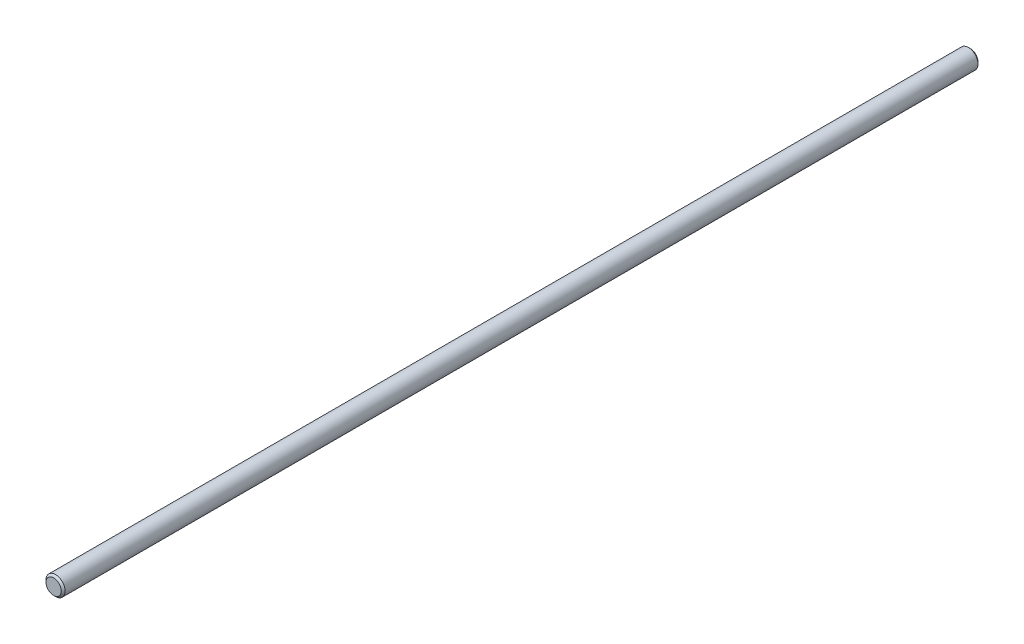
ISO-10303-21;
HEADER;
FILE_DESCRIPTION(('STEP AP214'),'2;1');
FILE_NAME('part.step','',(''),(''),'','','');
FILE_SCHEMA(('AUTOMOTIVE_DESIGN { 1 0 10303 214 1 1 1 1 }'));
ENDSEC;
DATA;
#1=APPLICATION_CONTEXT('core data for automotive mechanical design processes');
#2=APPLICATION_PROTOCOL_DEFINITION('international standard','automotive_design',2000,#1);
#3=PRODUCT_CONTEXT('',#1,'mechanical');
#4=PRODUCT('Part','Part','',(#3));
#5=PRODUCT_RELATED_PRODUCT_CATEGORY('part','',(#4));
#6=PRODUCT_DEFINITION_FORMATION('','',#4);
#7=PRODUCT_DEFINITION_CONTEXT('part definition',#1,'design');
#8=PRODUCT_DEFINITION('design','',#6,#7);
#9=PRODUCT_DEFINITION_SHAPE('','',#8);
#10=(LENGTH_UNIT() NAMED_UNIT(*) SI_UNIT(.MILLI.,.METRE.));
#11=(NAMED_UNIT(*) PLANE_ANGLE_UNIT() SI_UNIT($,.RADIAN.));
#12=(NAMED_UNIT(*) SI_UNIT($,.STERADIAN.) SOLID_ANGLE_UNIT());
#13=UNCERTAINTY_MEASURE_WITH_UNIT(LENGTH_MEASURE(1.E-05),#10,'distance_accuracy_value','');
#14=(GEOMETRIC_REPRESENTATION_CONTEXT(3) GLOBAL_UNCERTAINTY_ASSIGNED_CONTEXT((#13)) GLOBAL_UNIT_ASSIGNED_CONTEXT((#10,
#11,#12)) REPRESENTATION_CONTEXT('',''));
#15=CARTESIAN_POINT('',(0.,0.,0.));
#16=DIRECTION('',(0.,0.,1.));
#17=DIRECTION('',(1.,0.,0.));
#18=AXIS2_PLACEMENT_3D('',#15,#16,#17);
#19=CARTESIAN_POINT('',(0.,0.,76.2));
#20=DIRECTION('',(0.,0.,-1.));
#21=DIRECTION('',(-1.,0.,0.));
#22=AXIS2_PLACEMENT_3D('',#19,#20,#21);
#23=CYLINDRICAL_SURFACE('',#22,1.5875);
#24=CARTESIAN_POINT('',(0.,0.,-75.8824999999998));
#25=DIRECTION('',(0.,0.,1.));
#26=DIRECTION('',(1.,0.,0.));
#27=AXIS2_PLACEMENT_3D('',#24,#25,#26);
#28=CIRCLE('',#27,1.5875);
#29=CARTESIAN_POINT('',(-1.5875,0.,-75.8824999999999));
#30=VERTEX_POINT('',#29);
#31=EDGE_CURVE('E48',#30,#30,#28,.T.);
#32=CARTESIAN_POINT('',(0.,0.,75.8825000000001));
#33=DIRECTION('',(0.,0.,1.));
#34=DIRECTION('',(1.,0.,0.));
#35=AXIS2_PLACEMENT_3D('',#32,#33,#34);
#36=CIRCLE('',#35,1.5875);
#37=CARTESIAN_POINT('',(-1.5875,0.,75.8825000000001));
#38=VERTEX_POINT('',#37);
#39=EDGE_CURVE('E52',#38,#38,#36,.F.);
#40=CARTESIAN_POINT('',(-1.5875,0.,-75.8824999999999));
#41=CARTESIAN_POINT('',(-1.5875,0.,-74.3016145833332));
#42=CARTESIAN_POINT('',(-1.5875,0.,-72.7207291666665));
#43=CARTESIAN_POINT('',(-1.5875,0.,-69.5589583333332));
#44=CARTESIAN_POINT('',(-1.5875,0.,-67.9780729166665));
#45=CARTESIAN_POINT('',(-1.5875,0.,-64.8163020833332));
#46=CARTESIAN_POINT('',(-1.5875,0.,-63.2354166666665));
#47=CARTESIAN_POINT('',(-1.5875,0.,-60.0736458333332));
#48=CARTESIAN_POINT('',(-1.5875,0.,-58.4927604166665));
#49=CARTESIAN_POINT('',(-1.5875,0.,-55.3309895833332));
#50=CARTESIAN_POINT('',(-1.5875,0.,-53.7501041666665));
#51=CARTESIAN_POINT('',(-1.5875,0.,-50.5883333333332));
#52=CARTESIAN_POINT('',(-1.5875,0.,-49.0074479166665));
#53=CARTESIAN_POINT('',(-1.5875,0.,-45.8456770833332));
#54=CARTESIAN_POINT('',(-1.5875,0.,-44.2647916666665));
#55=CARTESIAN_POINT('',(-1.5875,0.,-41.1030208333332));
#56=CARTESIAN_POINT('',(-1.5875,0.,-39.5221354166665));
#57=CARTESIAN_POINT('',(-1.5875,0.,-36.3603645833332));
#58=CARTESIAN_POINT('',(-1.5875,0.,-34.7794791666665));
#59=CARTESIAN_POINT('',(-1.5875,0.,-31.6177083333332));
#60=CARTESIAN_POINT('',(-1.5875,0.,-30.0368229166665));
#61=CARTESIAN_POINT('',(-1.5875,0.,-26.8750520833332));
#62=CARTESIAN_POINT('',(-1.5875,0.,-25.2941666666665));
#63=CARTESIAN_POINT('',(-1.5875,0.,-22.1323958333332));
#64=CARTESIAN_POINT('',(-1.5875,0.,-20.5515104166665));
#65=CARTESIAN_POINT('',(-1.5875,0.,-17.3897395833332));
#66=CARTESIAN_POINT('',(-1.5875,0.,-15.8088541666665));
#67=CARTESIAN_POINT('',(-1.5875,0.,-12.6470833333332));
#68=CARTESIAN_POINT('',(-1.5875,0.,-11.0661979166665));
#69=CARTESIAN_POINT('',(-1.5875,0.,-7.90442708333321));
#70=CARTESIAN_POINT('',(-1.5875,0.,-6.32354166666654));
#71=CARTESIAN_POINT('',(-1.5875,0.,-3.16177083333321));
#72=CARTESIAN_POINT('',(-1.5875,0.,-1.58088541666654));
#73=CARTESIAN_POINT('',(-1.5875,0.,1.58088541666679));
#74=CARTESIAN_POINT('',(-1.5875,0.,3.16177083333346));
#75=CARTESIAN_POINT('',(-1.5875,0.,6.32354166666679));
#76=CARTESIAN_POINT('',(-1.5875,0.,7.90442708333346));
#77=CARTESIAN_POINT('',(-1.5875,0.,11.0661979166668));
#78=CARTESIAN_POINT('',(-1.5875,0.,12.6470833333335));
#79=CARTESIAN_POINT('',(-1.5875,0.,15.8088541666668));
#80=CARTESIAN_POINT('',(-1.5875,0.,17.3897395833335));
#81=CARTESIAN_POINT('',(-1.5875,0.,20.5515104166668));
#82=CARTESIAN_POINT('',(-1.5875,0.,22.1323958333335));
#83=CARTESIAN_POINT('',(-1.5875,0.,25.2941666666668));
#84=CARTESIAN_POINT('',(-1.5875,0.,26.8750520833335));
#85=CARTESIAN_POINT('',(-1.5875,0.,30.0368229166668));
#86=CARTESIAN_POINT('',(-1.5875,0.,31.6177083333335));
#87=CARTESIAN_POINT('',(-1.5875,0.,34.7794791666668));
#88=CARTESIAN_POINT('',(-1.5875,0.,36.3603645833334));
#89=CARTESIAN_POINT('',(-1.5875,0.,39.5221354166668));
#90=CARTESIAN_POINT('',(-1.5875,0.,41.1030208333334));
#91=CARTESIAN_POINT('',(-1.5875,0.,44.2647916666668));
#92=CARTESIAN_POINT('',(-1.5875,0.,45.8456770833335));
#93=CARTESIAN_POINT('',(-1.5875,0.,49.0074479166668));
#94=CARTESIAN_POINT('',(-1.5875,0.,50.5883333333335));
#95=CARTESIAN_POINT('',(-1.5875,0.,53.7501041666668));
#96=CARTESIAN_POINT('',(-1.5875,0.,55.3309895833335));
#97=CARTESIAN_POINT('',(-1.5875,0.,58.4927604166668));
#98=CARTESIAN_POINT('',(-1.5875,0.,60.0736458333334));
#99=CARTESIAN_POINT('',(-1.5875,0.,63.2354166666668));
#100=CARTESIAN_POINT('',(-1.5875,0.,64.8163020833334));
#101=CARTESIAN_POINT('',(-1.5875,0.,67.9780729166668));
#102=CARTESIAN_POINT('',(-1.5875,0.,69.5589583333335));
#103=CARTESIAN_POINT('',(-1.5875,0.,72.7207291666668));
#104=CARTESIAN_POINT('',(-1.5875,0.,74.3016145833334));
#105=CARTESIAN_POINT('',(-1.5875,0.,75.8825000000001));
#106=B_SPLINE_CURVE_WITH_KNOTS('',3,(#40,#41,#42,#43,#44,#45,#46,#47,#48,#49,#50,#51,#52,#53,
#54,#55,#56,#57,#58,#59,#60,#61,#62,#63,#64,#65,#66,#67,#68,#69,#70,#71,#72,#73,#74,#75,#76,#77,
#78,#79,#80,#81,#82,#83,#84,#85,#86,#87,#88,#89,#90,#91,#92,#93,#94,#95,#96,#97,#98,#99,#100,
#101,#102,#103,#104,#105),.UNSPECIFIED.,.F.,.F.,(4,2,2,2,2,2,2,2,2,2,2,2,2,2,2,2,2,2,2,2,2,2,2,
2,2,2,2,2,2,2,2,2,4),(0.,4.74265625,9.48531250000001,14.22796875,18.970625,23.71328125,
28.4559375,33.19859375,37.94125,42.68390625,47.4265625,52.16921875,56.911875,61.65453125,
66.3971875,71.13984375,75.8825,80.62515625,85.3678125,90.11046875,94.853125,99.59578125,
104.3384375,109.08109375,113.82375,118.56640625,123.3090625,128.05171875,132.794375,
137.53703125,142.2796875,147.02234375,151.765),.UNSPECIFIED.);
#107=EDGE_CURVE('BSEAM37',#30,#38,#106,.T.);
#108=ORIENTED_EDGE('',*,*,#31,.T.);
#109=ORIENTED_EDGE('',*,*,#39,.T.);
#110=ORIENTED_EDGE('',*,*,#107,.T.);
#111=ORIENTED_EDGE('',*,*,#107,.F.);
#112=EDGE_LOOP('',(#108,#110,#109,#111));
#113=FACE_BOUND('',#112,.T.);
#114=ADVANCED_FACE('F37',(#113),#23,.T.);
#115=CARTESIAN_POINT('',(0.,0.,76.2));
#116=DIRECTION('',(0.,0.,1.));
#117=DIRECTION('',(1.,0.,0.));
#118=AXIS2_PLACEMENT_3D('',#115,#116,#117);
#119=PLANE('',#118);
#120=CARTESIAN_POINT('',(0.,0.,76.2));
#121=DIRECTION('',(0.,0.,1.));
#122=DIRECTION('',(1.,0.,0.));
#123=AXIS2_PLACEMENT_3D('',#120,#121,#122);
#124=CIRCLE('',#123,1.27000000000012);
#125=CARTESIAN_POINT('',(1.27000000000012,0.,76.2));
#126=VERTEX_POINT('',#125);
#127=EDGE_CURVE('E10',#126,#126,#124,.T.);
#128=ORIENTED_EDGE('',*,*,#127,.T.);
#129=EDGE_LOOP('',(#128));
#130=FACE_BOUND('',#129,.T.);
#131=ADVANCED_FACE('F68',(#130),#119,.T.);
#132=CARTESIAN_POINT('',(0.,0.,-76.2));
#133=DIRECTION('',(0.,0.,1.));
#134=DIRECTION('',(1.,0.,0.));
#135=AXIS2_PLACEMENT_3D('',#132,#133,#134);
#136=PLANE('',#135);
#137=CARTESIAN_POINT('',(0.,0.,-76.2));
#138=DIRECTION('',(0.,0.,1.));
#139=DIRECTION('',(1.,0.,0.));
#140=AXIS2_PLACEMENT_3D('',#137,#138,#139);
#141=CIRCLE('',#140,1.26999999999983);
#142=CARTESIAN_POINT('',(1.26999999999983,0.,-76.2));
#143=VERTEX_POINT('',#142);
#144=EDGE_CURVE('E44',#143,#143,#141,.F.);
#145=ORIENTED_EDGE('',*,*,#144,.T.);
#146=EDGE_LOOP('',(#145));
#147=FACE_BOUND('',#146,.T.);
#148=ADVANCED_FACE('F65',(#147),#136,.F.);
#149=CARTESIAN_POINT('',(0.,0.,-75.8824999999998));
#150=DIRECTION('',(0.,0.,1.));
#151=DIRECTION('',(1.,0.,0.));
#152=AXIS2_PLACEMENT_3D('',#149,#150,#151);
#153=CONICAL_SURFACE('',#152,1.5875,0.785398163397462);
#154=ORIENTED_EDGE('',*,*,#144,.F.);
#155=EDGE_LOOP('',(#154));
#156=FACE_BOUND('',#155,.T.);
#157=ORIENTED_EDGE('',*,*,#31,.F.);
#158=EDGE_LOOP('',(#157));
#159=FACE_BOUND('',#158,.T.);
#160=ADVANCED_FACE('F61',(#156,#159),#153,.T.);
#161=CARTESIAN_POINT('',(0.,0.,76.2));
#162=DIRECTION('',(0.,0.,-1.));
#163=DIRECTION('',(-1.,0.,0.));
#164=AXIS2_PLACEMENT_3D('',#161,#162,#163);
#165=CONICAL_SURFACE('',#164,1.27000000000012,0.78539816339744);
#166=ORIENTED_EDGE('',*,*,#39,.F.);
#167=EDGE_LOOP('',(#166));
#168=FACE_BOUND('',#167,.T.);
#169=ORIENTED_EDGE('',*,*,#127,.F.);
#170=EDGE_LOOP('',(#169));
#171=FACE_BOUND('',#170,.T.);
#172=ADVANCED_FACE('F39',(#168,#171),#165,.T.);
#173=CLOSED_SHELL('',(#114,#131,#148,#160,#172));
#174=MANIFOLD_SOLID_BREP('B2',#173);
#175=ADVANCED_BREP_SHAPE_REPRESENTATION('',(#18,#174),#14);
#176=SHAPE_DEFINITION_REPRESENTATION(#9,#175);
ENDSEC;
END-ISO-10303-21;
